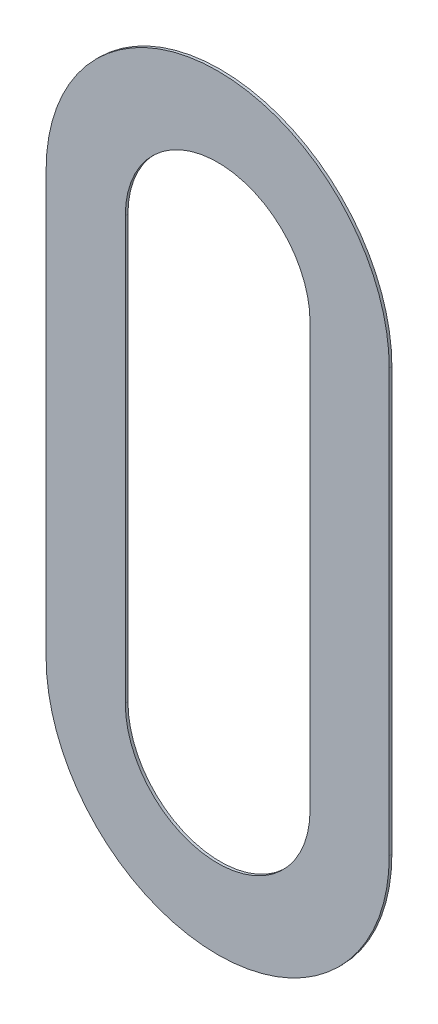
ISO-10303-21;
HEADER;
FILE_DESCRIPTION(('STEP AP214'),'2;1');
FILE_NAME('part.step','',(''),(''),'','','');
FILE_SCHEMA(('AUTOMOTIVE_DESIGN { 1 0 10303 214 1 1 1 1 }'));
ENDSEC;
DATA;
#1=APPLICATION_CONTEXT('core data for automotive mechanical design processes');
#2=APPLICATION_PROTOCOL_DEFINITION('international standard','automotive_design',2000,#1);
#3=PRODUCT_CONTEXT('',#1,'mechanical');
#4=PRODUCT('Part','Part','',(#3));
#5=PRODUCT_RELATED_PRODUCT_CATEGORY('part','',(#4));
#6=PRODUCT_DEFINITION_FORMATION('','',#4);
#7=PRODUCT_DEFINITION_CONTEXT('part definition',#1,'design');
#8=PRODUCT_DEFINITION('design','',#6,#7);
#9=PRODUCT_DEFINITION_SHAPE('','',#8);
#10=(LENGTH_UNIT() NAMED_UNIT(*) SI_UNIT(.MILLI.,.METRE.));
#11=(NAMED_UNIT(*) PLANE_ANGLE_UNIT() SI_UNIT($,.RADIAN.));
#12=(NAMED_UNIT(*) SI_UNIT($,.STERADIAN.) SOLID_ANGLE_UNIT());
#13=UNCERTAINTY_MEASURE_WITH_UNIT(LENGTH_MEASURE(1.E-05),#10,'distance_accuracy_value','');
#14=(GEOMETRIC_REPRESENTATION_CONTEXT(3) GLOBAL_UNCERTAINTY_ASSIGNED_CONTEXT((#13)) GLOBAL_UNIT_ASSIGNED_CONTEXT((#10,
#11,#12)) REPRESENTATION_CONTEXT('',''));
#15=CARTESIAN_POINT('',(0.,0.,0.));
#16=DIRECTION('',(0.,0.,1.));
#17=DIRECTION('',(1.,0.,0.));
#18=AXIS2_PLACEMENT_3D('',#15,#16,#17);
#19=CARTESIAN_POINT('',(0.,0.,0.01));
#20=DIRECTION('',(0.,0.,1.));
#21=DIRECTION('',(1.,0.,0.));
#22=AXIS2_PLACEMENT_3D('',#19,#20,#21);
#23=PLANE('',#22);
#24=CARTESIAN_POINT('',(6.4,2.63,0.01));
#25=DIRECTION('',(0.,0.,1.));
#26=DIRECTION('',(1.,0.,0.));
#27=AXIS2_PLACEMENT_3D('',#24,#25,#26);
#28=CIRCLE('',#27,0.35);
#29=CARTESIAN_POINT('',(6.75,2.63,0.01));
#30=VERTEX_POINT('',#29);
#31=CARTESIAN_POINT('',(6.05,2.63,0.01));
#32=VERTEX_POINT('',#31);
#33=EDGE_CURVE('E20',#30,#32,#28,.F.);
#34=ORIENTED_EDGE('',*,*,#33,.T.);
#35=DIRECTION('',(0.,1.,0.));
#36=VECTOR('',#35,1.);
#37=CARTESIAN_POINT('',(6.05,2.63,0.01));
#38=LINE('',#37,#36);
#39=CARTESIAN_POINT('',(6.05,4.23,0.01));
#40=VERTEX_POINT('',#39);
#41=EDGE_CURVE('E82',#40,#32,#38,.F.);
#42=ORIENTED_EDGE('',*,*,#41,.F.);
#43=CARTESIAN_POINT('',(6.4,4.23,0.01));
#44=DIRECTION('',(0.,0.,1.));
#45=DIRECTION('',(1.,0.,0.));
#46=AXIS2_PLACEMENT_3D('',#43,#44,#45);
#47=CIRCLE('',#46,0.35);
#48=CARTESIAN_POINT('',(6.75,4.23,0.01));
#49=VERTEX_POINT('',#48);
#50=EDGE_CURVE('E108',#40,#49,#47,.F.);
#51=ORIENTED_EDGE('',*,*,#50,.T.);
#52=DIRECTION('',(0.,1.,0.));
#53=VECTOR('',#52,1.);
#54=CARTESIAN_POINT('',(6.75,4.23,0.01));
#55=LINE('',#54,#53);
#56=EDGE_CURVE('E84',#30,#49,#55,.T.);
#57=ORIENTED_EDGE('',*,*,#56,.F.);
#58=EDGE_LOOP('',(#34,#42,#51,#57));
#59=FACE_BOUND('',#58,.T.);
#60=DIRECTION('',(0.,1.,0.));
#61=VECTOR('',#60,1.);
#62=CARTESIAN_POINT('',(5.75,4.23,0.01));
#63=LINE('',#62,#61);
#64=CARTESIAN_POINT('',(5.75,2.63,0.01));
#65=VERTEX_POINT('',#64);
#66=CARTESIAN_POINT('',(5.75,4.23,0.01));
#67=VERTEX_POINT('',#66);
#68=EDGE_CURVE('E110',#65,#67,#63,.T.);
#69=ORIENTED_EDGE('',*,*,#68,.F.);
#70=CARTESIAN_POINT('',(6.4,2.63,0.01));
#71=DIRECTION('',(0.,0.,1.));
#72=DIRECTION('',(1.,0.,0.));
#73=AXIS2_PLACEMENT_3D('',#70,#71,#72);
#74=CIRCLE('',#73,0.65);
#75=CARTESIAN_POINT('',(7.05,2.63,0.01));
#76=VERTEX_POINT('',#75);
#77=EDGE_CURVE('E85',#76,#65,#74,.F.);
#78=ORIENTED_EDGE('',*,*,#77,.F.);
#79=DIRECTION('',(0.,1.,0.));
#80=VECTOR('',#79,1.);
#81=CARTESIAN_POINT('',(7.05,2.63,0.01));
#82=LINE('',#81,#80);
#83=CARTESIAN_POINT('',(7.05,4.23,0.01));
#84=VERTEX_POINT('',#83);
#85=EDGE_CURVE('E118',#84,#76,#82,.F.);
#86=ORIENTED_EDGE('',*,*,#85,.F.);
#87=CARTESIAN_POINT('',(6.4,4.23,0.01));
#88=DIRECTION('',(0.,0.,1.));
#89=DIRECTION('',(1.,0.,0.));
#90=AXIS2_PLACEMENT_3D('',#87,#88,#89);
#91=CIRCLE('',#90,0.65);
#92=EDGE_CURVE('E116',#67,#84,#91,.F.);
#93=ORIENTED_EDGE('',*,*,#92,.F.);
#94=EDGE_LOOP('',(#69,#78,#86,#93));
#95=FACE_BOUND('',#94,.T.);
#96=ADVANCED_FACE('F17',(#59,#95),#23,.T.);
#97=CARTESIAN_POINT('',(6.4,2.63,0.));
#98=DIRECTION('',(0.,0.,1.));
#99=DIRECTION('',(1.,0.,0.));
#100=AXIS2_PLACEMENT_3D('',#97,#98,#99);
#101=CYLINDRICAL_SURFACE('',#100,0.65);
#102=DIRECTION('',(0.,0.,1.));
#103=VECTOR('',#102,1.);
#104=CARTESIAN_POINT('',(5.75,2.63,0.));
#105=LINE('',#104,#103);
#106=CARTESIAN_POINT('',(5.75,2.63,0.));
#107=VERTEX_POINT('',#106);
#108=EDGE_CURVE('E111',#107,#65,#105,.T.);
#109=ORIENTED_EDGE('',*,*,#108,.F.);
#110=CARTESIAN_POINT('',(6.4,2.63,0.));
#111=DIRECTION('',(0.,0.,1.));
#112=DIRECTION('',(1.,0.,0.));
#113=AXIS2_PLACEMENT_3D('',#110,#111,#112);
#114=CIRCLE('',#113,0.65);
#115=CARTESIAN_POINT('',(7.05,2.63,0.));
#116=VERTEX_POINT('',#115);
#117=EDGE_CURVE('E96',#107,#116,#114,.T.);
#118=ORIENTED_EDGE('',*,*,#117,.T.);
#119=DIRECTION('',(0.,0.,-1.));
#120=VECTOR('',#119,1.);
#121=CARTESIAN_POINT('',(7.05,2.63,0.));
#122=LINE('',#121,#120);
#123=EDGE_CURVE('E117',#76,#116,#122,.T.);
#124=ORIENTED_EDGE('',*,*,#123,.F.);
#125=ORIENTED_EDGE('',*,*,#77,.T.);
#126=EDGE_LOOP('',(#109,#118,#124,#125));
#127=FACE_BOUND('',#126,.T.);
#128=ADVANCED_FACE('F136',(#127),#101,.T.);
#129=CARTESIAN_POINT('',(7.05,2.63,0.));
#130=DIRECTION('',(1.,0.,0.));
#131=DIRECTION('',(0.,0.,-1.));
#132=AXIS2_PLACEMENT_3D('',#129,#130,#131);
#133=PLANE('',#132);
#134=ORIENTED_EDGE('',*,*,#123,.T.);
#135=DIRECTION('',(0.,1.,0.));
#136=VECTOR('',#135,1.);
#137=CARTESIAN_POINT('',(7.05,0.,0.));
#138=LINE('',#137,#136);
#139=CARTESIAN_POINT('',(7.05,4.23,0.));
#140=VERTEX_POINT('',#139);
#141=EDGE_CURVE('E99',#116,#140,#138,.T.);
#142=ORIENTED_EDGE('',*,*,#141,.T.);
#143=DIRECTION('',(0.,0.,1.));
#144=VECTOR('',#143,1.);
#145=CARTESIAN_POINT('',(7.05,4.23,0.));
#146=LINE('',#145,#144);
#147=EDGE_CURVE('E114',#84,#140,#146,.F.);
#148=ORIENTED_EDGE('',*,*,#147,.F.);
#149=ORIENTED_EDGE('',*,*,#85,.T.);
#150=EDGE_LOOP('',(#134,#142,#148,#149));
#151=FACE_BOUND('',#150,.T.);
#152=ADVANCED_FACE('F217',(#151),#133,.T.);
#153=CARTESIAN_POINT('',(6.4,4.23,0.));
#154=DIRECTION('',(0.,0.,1.));
#155=DIRECTION('',(1.,0.,0.));
#156=AXIS2_PLACEMENT_3D('',#153,#154,#155);
#157=CYLINDRICAL_SURFACE('',#156,0.65);
#158=ORIENTED_EDGE('',*,*,#147,.T.);
#159=CARTESIAN_POINT('',(6.4,4.23,0.));
#160=DIRECTION('',(0.,0.,1.));
#161=DIRECTION('',(1.,0.,0.));
#162=AXIS2_PLACEMENT_3D('',#159,#160,#161);
#163=CIRCLE('',#162,0.65);
#164=CARTESIAN_POINT('',(5.75,4.23,0.));
#165=VERTEX_POINT('',#164);
#166=EDGE_CURVE('E127',#140,#165,#163,.T.);
#167=ORIENTED_EDGE('',*,*,#166,.T.);
#168=DIRECTION('',(0.,0.,1.));
#169=VECTOR('',#168,1.);
#170=CARTESIAN_POINT('',(5.75,4.23,0.));
#171=LINE('',#170,#169);
#172=EDGE_CURVE('E93',#67,#165,#171,.F.);
#173=ORIENTED_EDGE('',*,*,#172,.F.);
#174=ORIENTED_EDGE('',*,*,#92,.T.);
#175=EDGE_LOOP('',(#158,#167,#173,#174));
#176=FACE_BOUND('',#175,.T.);
#177=ADVANCED_FACE('F147',(#176),#157,.T.);
#178=CARTESIAN_POINT('',(5.75,4.23,0.));
#179=DIRECTION('',(-1.,0.,0.));
#180=DIRECTION('',(0.,0.,1.));
#181=AXIS2_PLACEMENT_3D('',#178,#179,#180);
#182=PLANE('',#181);
#183=ORIENTED_EDGE('',*,*,#172,.T.);
#184=DIRECTION('',(0.,1.,0.));
#185=VECTOR('',#184,1.);
#186=CARTESIAN_POINT('',(5.75,0.,0.));
#187=LINE('',#186,#185);
#188=EDGE_CURVE('E129',#165,#107,#187,.F.);
#189=ORIENTED_EDGE('',*,*,#188,.T.);
#190=ORIENTED_EDGE('',*,*,#108,.T.);
#191=ORIENTED_EDGE('',*,*,#68,.T.);
#192=EDGE_LOOP('',(#183,#189,#190,#191));
#193=FACE_BOUND('',#192,.T.);
#194=ADVANCED_FACE('F141',(#193),#182,.T.);
#195=CARTESIAN_POINT('',(6.05,2.63,0.));
#196=DIRECTION('',(1.,0.,0.));
#197=DIRECTION('',(0.,0.,-1.));
#198=AXIS2_PLACEMENT_3D('',#195,#196,#197);
#199=PLANE('',#198);
#200=DIRECTION('',(0.,0.,1.));
#201=VECTOR('',#200,1.);
#202=CARTESIAN_POINT('',(6.05,2.63,0.));
#203=LINE('',#202,#201);
#204=CARTESIAN_POINT('',(6.05,2.63,0.));
#205=VERTEX_POINT('',#204);
#206=EDGE_CURVE('E91',#32,#205,#203,.F.);
#207=ORIENTED_EDGE('',*,*,#206,.T.);
#208=DIRECTION('',(0.,1.,0.));
#209=VECTOR('',#208,1.);
#210=CARTESIAN_POINT('',(6.05,0.,0.));
#211=LINE('',#210,#209);
#212=CARTESIAN_POINT('',(6.05,4.23,0.));
#213=VERTEX_POINT('',#212);
#214=EDGE_CURVE('E126',#205,#213,#211,.T.);
#215=ORIENTED_EDGE('',*,*,#214,.T.);
#216=DIRECTION('',(0.,0.,1.));
#217=VECTOR('',#216,1.);
#218=CARTESIAN_POINT('',(6.05,4.23,0.));
#219=LINE('',#218,#217);
#220=EDGE_CURVE('E92',#213,#40,#219,.T.);
#221=ORIENTED_EDGE('',*,*,#220,.T.);
#222=ORIENTED_EDGE('',*,*,#41,.T.);
#223=EDGE_LOOP('',(#207,#215,#221,#222));
#224=FACE_BOUND('',#223,.T.);
#225=ADVANCED_FACE('F89',(#224),#199,.T.);
#226=CARTESIAN_POINT('',(6.4,4.23,0.));
#227=DIRECTION('',(0.,0.,1.));
#228=DIRECTION('',(1.,0.,0.));
#229=AXIS2_PLACEMENT_3D('',#226,#227,#228);
#230=CYLINDRICAL_SURFACE('',#229,0.35);
#231=ORIENTED_EDGE('',*,*,#50,.F.);
#232=ORIENTED_EDGE('',*,*,#220,.F.);
#233=CARTESIAN_POINT('',(6.4,4.23,0.));
#234=DIRECTION('',(0.,0.,1.));
#235=DIRECTION('',(1.,0.,0.));
#236=AXIS2_PLACEMENT_3D('',#233,#234,#235);
#237=CIRCLE('',#236,0.35);
#238=CARTESIAN_POINT('',(6.75,4.23,0.));
#239=VERTEX_POINT('',#238);
#240=EDGE_CURVE('E123',#213,#239,#237,.F.);
#241=ORIENTED_EDGE('',*,*,#240,.T.);
#242=DIRECTION('',(0.,0.,1.));
#243=VECTOR('',#242,1.);
#244=CARTESIAN_POINT('',(6.75,4.23,0.));
#245=LINE('',#244,#243);
#246=EDGE_CURVE('E101',#49,#239,#245,.F.);
#247=ORIENTED_EDGE('',*,*,#246,.F.);
#248=EDGE_LOOP('',(#231,#232,#241,#247));
#249=FACE_BOUND('',#248,.T.);
#250=ADVANCED_FACE('F163',(#249),#230,.F.);
#251=CARTESIAN_POINT('',(6.75,4.23,0.));
#252=DIRECTION('',(-1.,0.,0.));
#253=DIRECTION('',(0.,0.,1.));
#254=AXIS2_PLACEMENT_3D('',#251,#252,#253);
#255=PLANE('',#254);
#256=ORIENTED_EDGE('',*,*,#246,.T.);
#257=DIRECTION('',(0.,1.,0.));
#258=VECTOR('',#257,1.);
#259=CARTESIAN_POINT('',(6.75,0.,0.));
#260=LINE('',#259,#258);
#261=CARTESIAN_POINT('',(6.75,2.63,0.));
#262=VERTEX_POINT('',#261);
#263=EDGE_CURVE('E26',#239,#262,#260,.F.);
#264=ORIENTED_EDGE('',*,*,#263,.T.);
#265=DIRECTION('',(0.,0.,1.));
#266=VECTOR('',#265,1.);
#267=CARTESIAN_POINT('',(6.75,2.63,0.));
#268=LINE('',#267,#266);
#269=EDGE_CURVE('E34',#262,#30,#268,.T.);
#270=ORIENTED_EDGE('',*,*,#269,.T.);
#271=ORIENTED_EDGE('',*,*,#56,.T.);
#272=EDGE_LOOP('',(#256,#264,#270,#271));
#273=FACE_BOUND('',#272,.T.);
#274=ADVANCED_FACE('F158',(#273),#255,.T.);
#275=CARTESIAN_POINT('',(6.4,2.63,0.));
#276=DIRECTION('',(0.,0.,1.));
#277=DIRECTION('',(1.,0.,0.));
#278=AXIS2_PLACEMENT_3D('',#275,#276,#277);
#279=CYLINDRICAL_SURFACE('',#278,0.35);
#280=ORIENTED_EDGE('',*,*,#33,.F.);
#281=ORIENTED_EDGE('',*,*,#269,.F.);
#282=CARTESIAN_POINT('',(6.4,2.63,0.));
#283=DIRECTION('',(0.,0.,1.));
#284=DIRECTION('',(1.,0.,0.));
#285=AXIS2_PLACEMENT_3D('',#282,#283,#284);
#286=CIRCLE('',#285,0.35);
#287=EDGE_CURVE('E11',#262,#205,#286,.F.);
#288=ORIENTED_EDGE('',*,*,#287,.T.);
#289=ORIENTED_EDGE('',*,*,#206,.F.);
#290=EDGE_LOOP('',(#280,#281,#288,#289));
#291=FACE_BOUND('',#290,.T.);
#292=ADVANCED_FACE('F95',(#291),#279,.F.);
#293=CARTESIAN_POINT('',(0.,0.,0.));
#294=DIRECTION('',(0.,0.,1.));
#295=DIRECTION('',(1.,0.,0.));
#296=AXIS2_PLACEMENT_3D('',#293,#294,#295);
#297=PLANE('',#296);
#298=ORIENTED_EDGE('',*,*,#263,.F.);
#299=ORIENTED_EDGE('',*,*,#240,.F.);
#300=ORIENTED_EDGE('',*,*,#214,.F.);
#301=ORIENTED_EDGE('',*,*,#287,.F.);
#302=EDGE_LOOP('',(#298,#299,#300,#301));
#303=FACE_BOUND('',#302,.T.);
#304=ORIENTED_EDGE('',*,*,#166,.F.);
#305=ORIENTED_EDGE('',*,*,#141,.F.);
#306=ORIENTED_EDGE('',*,*,#117,.F.);
#307=ORIENTED_EDGE('',*,*,#188,.F.);
#308=EDGE_LOOP('',(#304,#305,#306,#307));
#309=FACE_BOUND('',#308,.T.);
#310=ADVANCED_FACE('F150',(#303,#309),#297,.F.);
#311=CLOSED_SHELL('',(#96,#128,#152,#177,#194,#225,#250,#274,#292,#310));
#312=MANIFOLD_SOLID_BREP('B1',#311);
#313=ADVANCED_BREP_SHAPE_REPRESENTATION('',(#18,#312),#14);
#314=SHAPE_DEFINITION_REPRESENTATION(#9,#313);
ENDSEC;
END-ISO-10303-21;
